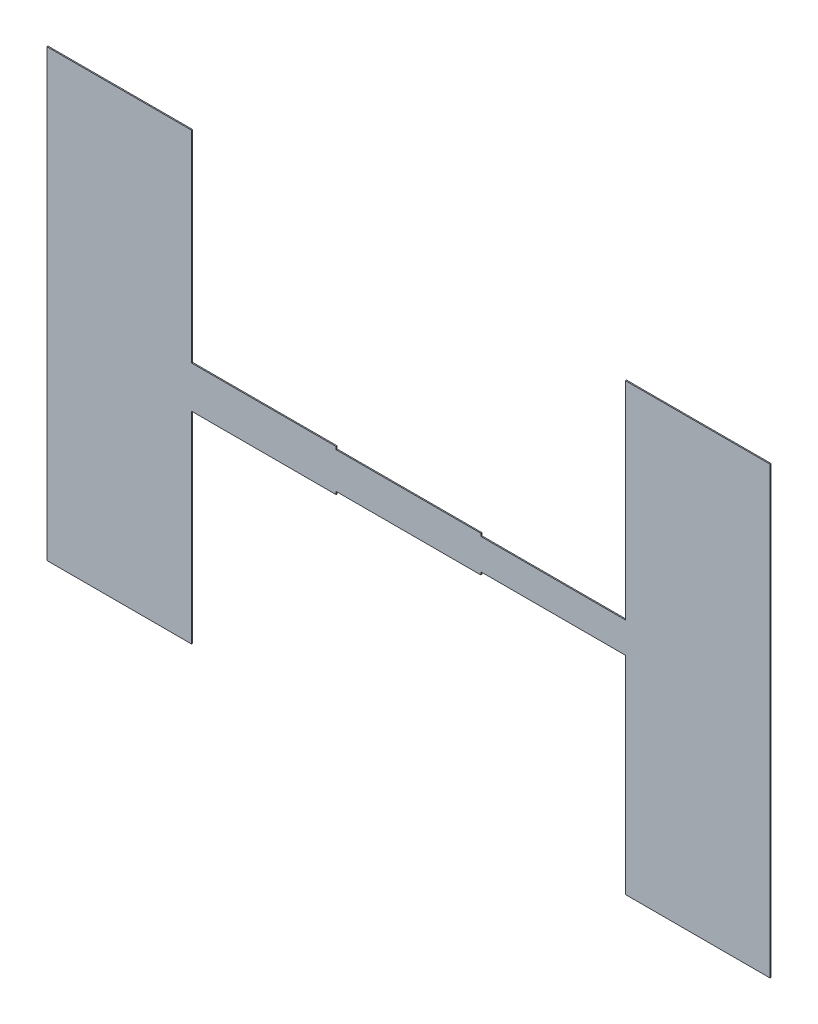
ISO-10303-21;
HEADER;
FILE_DESCRIPTION(('STEP AP214'),'2;1');
FILE_NAME('part.step','',(''),(''),'','','');
FILE_SCHEMA(('AUTOMOTIVE_DESIGN { 1 0 10303 214 1 1 1 1 }'));
ENDSEC;
DATA;
#1=APPLICATION_CONTEXT('core data for automotive mechanical design processes');
#2=APPLICATION_PROTOCOL_DEFINITION('international standard','automotive_design',2000,#1);
#3=PRODUCT_CONTEXT('',#1,'mechanical');
#4=PRODUCT('Part','Part','',(#3));
#5=PRODUCT_RELATED_PRODUCT_CATEGORY('part','',(#4));
#6=PRODUCT_DEFINITION_FORMATION('','',#4);
#7=PRODUCT_DEFINITION_CONTEXT('part definition',#1,'design');
#8=PRODUCT_DEFINITION('design','',#6,#7);
#9=PRODUCT_DEFINITION_SHAPE('','',#8);
#10=(LENGTH_UNIT() NAMED_UNIT(*) SI_UNIT(.MILLI.,.METRE.));
#11=(NAMED_UNIT(*) PLANE_ANGLE_UNIT() SI_UNIT($,.RADIAN.));
#12=(NAMED_UNIT(*) SI_UNIT($,.STERADIAN.) SOLID_ANGLE_UNIT());
#13=UNCERTAINTY_MEASURE_WITH_UNIT(LENGTH_MEASURE(1.E-05),#10,'distance_accuracy_value','');
#14=(GEOMETRIC_REPRESENTATION_CONTEXT(3) GLOBAL_UNCERTAINTY_ASSIGNED_CONTEXT((#13)) GLOBAL_UNIT_ASSIGNED_CONTEXT((#10,
#11,#12)) REPRESENTATION_CONTEXT('',''));
#15=CARTESIAN_POINT('',(0.,0.,0.));
#16=DIRECTION('',(0.,0.,1.));
#17=DIRECTION('',(1.,0.,0.));
#18=AXIS2_PLACEMENT_3D('',#15,#16,#17);
#19=CARTESIAN_POINT('',(4550.,0.,10.));
#20=DIRECTION('',(-1.,0.,0.));
#21=DIRECTION('',(0.,0.,1.));
#22=AXIS2_PLACEMENT_3D('',#19,#20,#21);
#23=PLANE('',#22);
#24=DIRECTION('',(0.,1.,0.));
#25=VECTOR('',#24,1.);
#26=CARTESIAN_POINT('',(4550.,0.,0.));
#27=LINE('',#26,#25);
#28=CARTESIAN_POINT('',(4550.,-2000.,0.));
#29=VERTEX_POINT('',#28);
#30=CARTESIAN_POINT('',(4550.,-137.5,0.));
#31=VERTEX_POINT('',#30);
#32=EDGE_CURVE('E220',#29,#31,#27,.T.);
#33=ORIENTED_EDGE('',*,*,#32,.F.);
#34=DIRECTION('',(0.,0.,-1.));
#35=VECTOR('',#34,1.);
#36=CARTESIAN_POINT('',(4550.,-2000.,10.));
#37=LINE('',#36,#35);
#38=CARTESIAN_POINT('',(4550.,-2000.,10.));
#39=VERTEX_POINT('',#38);
#40=EDGE_CURVE('E11',#39,#29,#37,.T.);
#41=ORIENTED_EDGE('',*,*,#40,.F.);
#42=DIRECTION('',(0.,1.,0.));
#43=VECTOR('',#42,1.);
#44=CARTESIAN_POINT('',(4550.,0.,10.));
#45=LINE('',#44,#43);
#46=CARTESIAN_POINT('',(4550.,-137.5,10.));
#47=VERTEX_POINT('',#46);
#48=EDGE_CURVE('E289',#39,#47,#45,.T.);
#49=ORIENTED_EDGE('',*,*,#48,.T.);
#50=DIRECTION('',(0.,0.,-1.));
#51=VECTOR('',#50,1.);
#52=CARTESIAN_POINT('',(4550.,-137.5,10.));
#53=LINE('',#52,#51);
#54=EDGE_CURVE('E64',#47,#31,#53,.T.);
#55=ORIENTED_EDGE('',*,*,#54,.T.);
#56=EDGE_LOOP('',(#33,#41,#49,#55));
#57=FACE_BOUND('',#56,.T.);
#58=ADVANCED_FACE('F47',(#57),#23,.T.);
#59=CARTESIAN_POINT('',(3.41607084500048E-13,-2000.,10.));
#60=DIRECTION('',(0.,-1.,0.));
#61=DIRECTION('',(1.,0.,0.));
#62=AXIS2_PLACEMENT_3D('',#59,#60,#61);
#63=PLANE('',#62);
#64=DIRECTION('',(-1.,0.,0.));
#65=VECTOR('',#64,1.);
#66=CARTESIAN_POINT('',(3.41607084500048E-13,-2000.,0.));
#67=LINE('',#66,#65);
#68=CARTESIAN_POINT('',(5850.,-2000.,0.));
#69=VERTEX_POINT('',#68);
#70=EDGE_CURVE('E223',#69,#29,#67,.T.);
#71=ORIENTED_EDGE('',*,*,#70,.F.);
#72=DIRECTION('',(0.,0.,-1.));
#73=VECTOR('',#72,1.);
#74=CARTESIAN_POINT('',(5850.,-2000.,10.));
#75=LINE('',#74,#73);
#76=CARTESIAN_POINT('',(5850.,-2000.,10.));
#77=VERTEX_POINT('',#76);
#78=EDGE_CURVE('E56',#77,#69,#75,.T.);
#79=ORIENTED_EDGE('',*,*,#78,.F.);
#80=DIRECTION('',(-1.,0.,0.));
#81=VECTOR('',#80,1.);
#82=CARTESIAN_POINT('',(3.41607084500048E-13,-2000.,10.));
#83=LINE('',#82,#81);
#84=EDGE_CURVE('E359',#77,#39,#83,.T.);
#85=ORIENTED_EDGE('',*,*,#84,.T.);
#86=ORIENTED_EDGE('',*,*,#40,.T.);
#87=EDGE_LOOP('',(#71,#79,#85,#86));
#88=FACE_BOUND('',#87,.T.);
#89=ADVANCED_FACE('F358',(#88),#63,.T.);
#90=CARTESIAN_POINT('',(5850.,0.,10.));
#91=DIRECTION('',(-1.,0.,0.));
#92=DIRECTION('',(0.,0.,1.));
#93=AXIS2_PLACEMENT_3D('',#90,#91,#92);
#94=PLANE('',#93);
#95=DIRECTION('',(0.,1.,0.));
#96=VECTOR('',#95,1.);
#97=CARTESIAN_POINT('',(5850.,0.,0.));
#98=LINE('',#97,#96);
#99=CARTESIAN_POINT('',(5850.,2000.,0.));
#100=VERTEX_POINT('',#99);
#101=EDGE_CURVE('E227',#69,#100,#98,.T.);
#102=ORIENTED_EDGE('',*,*,#101,.T.);
#103=DIRECTION('',(0.,0.,-1.));
#104=VECTOR('',#103,1.);
#105=CARTESIAN_POINT('',(5850.,2000.,10.));
#106=LINE('',#105,#104);
#107=CARTESIAN_POINT('',(5850.,2000.,10.));
#108=VERTEX_POINT('',#107);
#109=EDGE_CURVE('E341',#108,#100,#106,.T.);
#110=ORIENTED_EDGE('',*,*,#109,.F.);
#111=DIRECTION('',(0.,1.,0.));
#112=VECTOR('',#111,1.);
#113=CARTESIAN_POINT('',(5850.,0.,10.));
#114=LINE('',#113,#112);
#115=EDGE_CURVE('E350',#77,#108,#114,.T.);
#116=ORIENTED_EDGE('',*,*,#115,.F.);
#117=ORIENTED_EDGE('',*,*,#78,.T.);
#118=EDGE_LOOP('',(#102,#110,#116,#117));
#119=FACE_BOUND('',#118,.T.);
#120=ADVANCED_FACE('F348',(#119),#94,.F.);
#121=CARTESIAN_POINT('',(0.,2000.,10.));
#122=DIRECTION('',(0.,-1.,0.));
#123=DIRECTION('',(0.,0.,-1.));
#124=AXIS2_PLACEMENT_3D('',#121,#122,#123);
#125=PLANE('',#124);
#126=DIRECTION('',(-1.,0.,0.));
#127=VECTOR('',#126,1.);
#128=CARTESIAN_POINT('',(0.,2000.,0.));
#129=LINE('',#128,#127);
#130=CARTESIAN_POINT('',(4550.,2000.,0.));
#131=VERTEX_POINT('',#130);
#132=EDGE_CURVE('E230',#100,#131,#129,.T.);
#133=ORIENTED_EDGE('',*,*,#132,.T.);
#134=DIRECTION('',(0.,0.,-1.));
#135=VECTOR('',#134,1.);
#136=CARTESIAN_POINT('',(4550.,2000.,10.));
#137=LINE('',#136,#135);
#138=CARTESIAN_POINT('',(4550.,2000.,10.));
#139=VERTEX_POINT('',#138);
#140=EDGE_CURVE('E338',#139,#131,#137,.T.);
#141=ORIENTED_EDGE('',*,*,#140,.F.);
#142=DIRECTION('',(-1.,0.,0.));
#143=VECTOR('',#142,1.);
#144=CARTESIAN_POINT('',(0.,2000.,10.));
#145=LINE('',#144,#143);
#146=EDGE_CURVE('E609',#108,#139,#145,.T.);
#147=ORIENTED_EDGE('',*,*,#146,.F.);
#148=ORIENTED_EDGE('',*,*,#109,.T.);
#149=EDGE_LOOP('',(#133,#141,#147,#148));
#150=FACE_BOUND('',#149,.T.);
#151=ADVANCED_FACE('F377',(#150),#125,.F.);
#152=CARTESIAN_POINT('',(4550.,0.,10.));
#153=DIRECTION('',(-1.,0.,0.));
#154=DIRECTION('',(0.,0.,1.));
#155=AXIS2_PLACEMENT_3D('',#152,#153,#154);
#156=PLANE('',#155);
#157=DIRECTION('',(0.,1.,0.));
#158=VECTOR('',#157,1.);
#159=CARTESIAN_POINT('',(4550.,0.,0.));
#160=LINE('',#159,#158);
#161=CARTESIAN_POINT('',(4550.,137.5,0.));
#162=VERTEX_POINT('',#161);
#163=EDGE_CURVE('E234',#162,#131,#160,.T.);
#164=ORIENTED_EDGE('',*,*,#163,.F.);
#165=DIRECTION('',(0.,0.,-1.));
#166=VECTOR('',#165,1.);
#167=CARTESIAN_POINT('',(4550.,137.5,10.));
#168=LINE('',#167,#166);
#169=CARTESIAN_POINT('',(4550.,137.5,10.));
#170=VERTEX_POINT('',#169);
#171=EDGE_CURVE('E335',#170,#162,#168,.T.);
#172=ORIENTED_EDGE('',*,*,#171,.F.);
#173=DIRECTION('',(0.,1.,0.));
#174=VECTOR('',#173,1.);
#175=CARTESIAN_POINT('',(4550.,0.,10.));
#176=LINE('',#175,#174);
#177=EDGE_CURVE('E607',#170,#139,#176,.T.);
#178=ORIENTED_EDGE('',*,*,#177,.T.);
#179=ORIENTED_EDGE('',*,*,#140,.T.);
#180=EDGE_LOOP('',(#164,#172,#178,#179));
#181=FACE_BOUND('',#180,.T.);
#182=ADVANCED_FACE('F382',(#181),#156,.T.);
#183=CARTESIAN_POINT('',(0.,137.499999999999,10.));
#184=DIRECTION('',(0.,-1.,0.));
#185=DIRECTION('',(1.,0.,0.));
#186=AXIS2_PLACEMENT_3D('',#183,#184,#185);
#187=PLANE('',#186);
#188=DIRECTION('',(-1.,0.,0.));
#189=VECTOR('',#188,1.);
#190=CARTESIAN_POINT('',(0.,137.499999999999,0.));
#191=LINE('',#190,#189);
#192=CARTESIAN_POINT('',(3250.,137.5,0.));
#193=VERTEX_POINT('',#192);
#194=EDGE_CURVE('E238',#162,#193,#191,.T.);
#195=ORIENTED_EDGE('',*,*,#194,.T.);
#196=DIRECTION('',(0.,0.,-1.));
#197=VECTOR('',#196,1.);
#198=CARTESIAN_POINT('',(3250.,137.5,10.));
#199=LINE('',#198,#197);
#200=CARTESIAN_POINT('',(3250.,137.5,10.));
#201=VERTEX_POINT('',#200);
#202=EDGE_CURVE('E331',#201,#193,#199,.T.);
#203=ORIENTED_EDGE('',*,*,#202,.F.);
#204=DIRECTION('',(-1.,0.,0.));
#205=VECTOR('',#204,1.);
#206=CARTESIAN_POINT('',(0.,137.499999999999,10.));
#207=LINE('',#206,#205);
#208=EDGE_CURVE('E602',#170,#201,#207,.T.);
#209=ORIENTED_EDGE('',*,*,#208,.F.);
#210=ORIENTED_EDGE('',*,*,#171,.T.);
#211=EDGE_LOOP('',(#195,#203,#209,#210));
#212=FACE_BOUND('',#211,.T.);
#213=ADVANCED_FACE('F386',(#212),#187,.F.);
#214=CARTESIAN_POINT('',(3250.,0.,10.));
#215=DIRECTION('',(-1.,0.,0.));
#216=DIRECTION('',(0.,0.,1.));
#217=AXIS2_PLACEMENT_3D('',#214,#215,#216);
#218=PLANE('',#217);
#219=DIRECTION('',(0.,1.,0.));
#220=VECTOR('',#219,1.);
#221=CARTESIAN_POINT('',(3250.,0.,0.));
#222=LINE('',#221,#220);
#223=CARTESIAN_POINT('',(3250.,162.5,0.));
#224=VERTEX_POINT('',#223);
#225=EDGE_CURVE('E241',#193,#224,#222,.T.);
#226=ORIENTED_EDGE('',*,*,#225,.T.);
#227=DIRECTION('',(0.,0.,-1.));
#228=VECTOR('',#227,1.);
#229=CARTESIAN_POINT('',(3250.,162.5,10.));
#230=LINE('',#229,#228);
#231=CARTESIAN_POINT('',(3250.,162.5,10.));
#232=VERTEX_POINT('',#231);
#233=EDGE_CURVE('E327',#232,#224,#230,.T.);
#234=ORIENTED_EDGE('',*,*,#233,.F.);
#235=DIRECTION('',(0.,1.,0.));
#236=VECTOR('',#235,1.);
#237=CARTESIAN_POINT('',(3250.,0.,10.));
#238=LINE('',#237,#236);
#239=EDGE_CURVE('E599',#201,#232,#238,.T.);
#240=ORIENTED_EDGE('',*,*,#239,.F.);
#241=ORIENTED_EDGE('',*,*,#202,.T.);
#242=EDGE_LOOP('',(#226,#234,#240,#241));
#243=FACE_BOUND('',#242,.T.);
#244=ADVANCED_FACE('F390',(#243),#218,.F.);
#245=CARTESIAN_POINT('',(0.,162.5,10.));
#246=DIRECTION('',(0.,-1.,0.));
#247=DIRECTION('',(1.,0.,0.));
#248=AXIS2_PLACEMENT_3D('',#245,#246,#247);
#249=PLANE('',#248);
#250=DIRECTION('',(-1.,0.,0.));
#251=VECTOR('',#250,1.);
#252=CARTESIAN_POINT('',(0.,162.5,0.));
#253=LINE('',#252,#251);
#254=CARTESIAN_POINT('',(1950.,162.5,0.));
#255=VERTEX_POINT('',#254);
#256=EDGE_CURVE('E244',#224,#255,#253,.T.);
#257=ORIENTED_EDGE('',*,*,#256,.T.);
#258=DIRECTION('',(0.,0.,-1.));
#259=VECTOR('',#258,1.);
#260=CARTESIAN_POINT('',(1950.,162.5,10.));
#261=LINE('',#260,#259);
#262=CARTESIAN_POINT('',(1950.,162.5,10.));
#263=VERTEX_POINT('',#262);
#264=EDGE_CURVE('E323',#263,#255,#261,.T.);
#265=ORIENTED_EDGE('',*,*,#264,.F.);
#266=DIRECTION('',(-1.,0.,0.));
#267=VECTOR('',#266,1.);
#268=CARTESIAN_POINT('',(0.,162.5,10.));
#269=LINE('',#268,#267);
#270=EDGE_CURVE('E597',#232,#263,#269,.T.);
#271=ORIENTED_EDGE('',*,*,#270,.F.);
#272=ORIENTED_EDGE('',*,*,#233,.T.);
#273=EDGE_LOOP('',(#257,#265,#271,#272));
#274=FACE_BOUND('',#273,.T.);
#275=ADVANCED_FACE('F394',(#274),#249,.F.);
#276=CARTESIAN_POINT('',(1950.,0.,10.));
#277=DIRECTION('',(-1.,0.,0.));
#278=DIRECTION('',(0.,0.,1.));
#279=AXIS2_PLACEMENT_3D('',#276,#277,#278);
#280=PLANE('',#279);
#281=DIRECTION('',(0.,1.,0.));
#282=VECTOR('',#281,1.);
#283=CARTESIAN_POINT('',(1950.,0.,0.));
#284=LINE('',#283,#282);
#285=CARTESIAN_POINT('',(1950.,187.5,0.));
#286=VERTEX_POINT('',#285);
#287=EDGE_CURVE('E247',#255,#286,#284,.T.);
#288=ORIENTED_EDGE('',*,*,#287,.T.);
#289=DIRECTION('',(0.,0.,-1.));
#290=VECTOR('',#289,1.);
#291=CARTESIAN_POINT('',(1950.,187.5,10.));
#292=LINE('',#291,#290);
#293=CARTESIAN_POINT('',(1950.,187.5,10.));
#294=VERTEX_POINT('',#293);
#295=EDGE_CURVE('E319',#294,#286,#292,.T.);
#296=ORIENTED_EDGE('',*,*,#295,.F.);
#297=DIRECTION('',(0.,1.,0.));
#298=VECTOR('',#297,1.);
#299=CARTESIAN_POINT('',(1950.,0.,10.));
#300=LINE('',#299,#298);
#301=EDGE_CURVE('E590',#263,#294,#300,.T.);
#302=ORIENTED_EDGE('',*,*,#301,.F.);
#303=ORIENTED_EDGE('',*,*,#264,.T.);
#304=EDGE_LOOP('',(#288,#296,#302,#303));
#305=FACE_BOUND('',#304,.T.);
#306=ADVANCED_FACE('F398',(#305),#280,.F.);
#307=CARTESIAN_POINT('',(0.,187.499999999999,10.));
#308=DIRECTION('',(0.,-1.,0.));
#309=DIRECTION('',(1.,0.,0.));
#310=AXIS2_PLACEMENT_3D('',#307,#308,#309);
#311=PLANE('',#310);
#312=DIRECTION('',(-1.,0.,0.));
#313=VECTOR('',#312,1.);
#314=CARTESIAN_POINT('',(0.,187.499999999999,0.));
#315=LINE('',#314,#313);
#316=CARTESIAN_POINT('',(650.,187.5,0.));
#317=VERTEX_POINT('',#316);
#318=EDGE_CURVE('E250',#286,#317,#315,.T.);
#319=ORIENTED_EDGE('',*,*,#318,.T.);
#320=DIRECTION('',(0.,0.,-1.));
#321=VECTOR('',#320,1.);
#322=CARTESIAN_POINT('',(650.,187.5,10.));
#323=LINE('',#322,#321);
#324=CARTESIAN_POINT('',(650.,187.5,10.));
#325=VERTEX_POINT('',#324);
#326=EDGE_CURVE('E315',#325,#317,#323,.T.);
#327=ORIENTED_EDGE('',*,*,#326,.F.);
#328=DIRECTION('',(-1.,0.,0.));
#329=VECTOR('',#328,1.);
#330=CARTESIAN_POINT('',(0.,187.499999999999,10.));
#331=LINE('',#330,#329);
#332=EDGE_CURVE('E587',#294,#325,#331,.T.);
#333=ORIENTED_EDGE('',*,*,#332,.F.);
#334=ORIENTED_EDGE('',*,*,#295,.T.);
#335=EDGE_LOOP('',(#319,#327,#333,#334));
#336=FACE_BOUND('',#335,.T.);
#337=ADVANCED_FACE('F402',(#336),#311,.F.);
#338=CARTESIAN_POINT('',(650.,0.,10.));
#339=DIRECTION('',(-1.,0.,0.));
#340=DIRECTION('',(0.,0.,1.));
#341=AXIS2_PLACEMENT_3D('',#338,#339,#340);
#342=PLANE('',#341);
#343=DIRECTION('',(0.,1.,0.));
#344=VECTOR('',#343,1.);
#345=CARTESIAN_POINT('',(650.,0.,0.));
#346=LINE('',#345,#344);
#347=CARTESIAN_POINT('',(650.,2000.,0.));
#348=VERTEX_POINT('',#347);
#349=EDGE_CURVE('E253',#317,#348,#346,.T.);
#350=ORIENTED_EDGE('',*,*,#349,.T.);
#351=DIRECTION('',(0.,0.,-1.));
#352=VECTOR('',#351,1.);
#353=CARTESIAN_POINT('',(650.,2000.,10.));
#354=LINE('',#353,#352);
#355=CARTESIAN_POINT('',(650.,2000.,10.));
#356=VERTEX_POINT('',#355);
#357=EDGE_CURVE('E312',#356,#348,#354,.T.);
#358=ORIENTED_EDGE('',*,*,#357,.F.);
#359=DIRECTION('',(0.,1.,0.));
#360=VECTOR('',#359,1.);
#361=CARTESIAN_POINT('',(650.,0.,10.));
#362=LINE('',#361,#360);
#363=EDGE_CURVE('E585',#325,#356,#362,.T.);
#364=ORIENTED_EDGE('',*,*,#363,.F.);
#365=ORIENTED_EDGE('',*,*,#326,.T.);
#366=EDGE_LOOP('',(#350,#358,#364,#365));
#367=FACE_BOUND('',#366,.T.);
#368=ADVANCED_FACE('F406',(#367),#342,.F.);
#369=CARTESIAN_POINT('',(0.,2000.,10.));
#370=DIRECTION('',(0.,1.,0.));
#371=DIRECTION('',(0.,0.,1.));
#372=AXIS2_PLACEMENT_3D('',#369,#370,#371);
#373=PLANE('',#372);
#374=DIRECTION('',(1.,0.,0.));
#375=VECTOR('',#374,1.);
#376=CARTESIAN_POINT('',(0.,2000.,0.));
#377=LINE('',#376,#375);
#378=CARTESIAN_POINT('',(-650.,2000.,0.));
#379=VERTEX_POINT('',#378);
#380=EDGE_CURVE('E257',#379,#348,#377,.T.);
#381=ORIENTED_EDGE('',*,*,#380,.F.);
#382=DIRECTION('',(0.,0.,-1.));
#383=VECTOR('',#382,1.);
#384=CARTESIAN_POINT('',(-650.,2000.,10.));
#385=LINE('',#384,#383);
#386=CARTESIAN_POINT('',(-650.,2000.,10.));
#387=VERTEX_POINT('',#386);
#388=EDGE_CURVE('E309',#387,#379,#385,.T.);
#389=ORIENTED_EDGE('',*,*,#388,.F.);
#390=DIRECTION('',(1.,0.,0.));
#391=VECTOR('',#390,1.);
#392=CARTESIAN_POINT('',(0.,2000.,10.));
#393=LINE('',#392,#391);
#394=EDGE_CURVE('E630',#387,#356,#393,.T.);
#395=ORIENTED_EDGE('',*,*,#394,.T.);
#396=ORIENTED_EDGE('',*,*,#357,.T.);
#397=EDGE_LOOP('',(#381,#389,#395,#396));
#398=FACE_BOUND('',#397,.T.);
#399=ADVANCED_FACE('F410',(#398),#373,.T.);
#400=CARTESIAN_POINT('',(-650.,0.,10.));
#401=DIRECTION('',(-1.,0.,0.));
#402=DIRECTION('',(0.,0.,1.));
#403=AXIS2_PLACEMENT_3D('',#400,#401,#402);
#404=PLANE('',#403);
#405=DIRECTION('',(0.,1.,0.));
#406=VECTOR('',#405,1.);
#407=CARTESIAN_POINT('',(-650.,0.,0.));
#408=LINE('',#407,#406);
#409=CARTESIAN_POINT('',(-650.,-2000.,0.));
#410=VERTEX_POINT('',#409);
#411=EDGE_CURVE('E261',#410,#379,#408,.T.);
#412=ORIENTED_EDGE('',*,*,#411,.F.);
#413=DIRECTION('',(0.,0.,-1.));
#414=VECTOR('',#413,1.);
#415=CARTESIAN_POINT('',(-650.,-2000.,10.));
#416=LINE('',#415,#414);
#417=CARTESIAN_POINT('',(-650.,-2000.,10.));
#418=VERTEX_POINT('',#417);
#419=EDGE_CURVE('E306',#418,#410,#416,.T.);
#420=ORIENTED_EDGE('',*,*,#419,.F.);
#421=DIRECTION('',(0.,1.,0.));
#422=VECTOR('',#421,1.);
#423=CARTESIAN_POINT('',(-650.,0.,10.));
#424=LINE('',#423,#422);
#425=EDGE_CURVE('E576',#418,#387,#424,.T.);
#426=ORIENTED_EDGE('',*,*,#425,.T.);
#427=ORIENTED_EDGE('',*,*,#388,.T.);
#428=EDGE_LOOP('',(#412,#420,#426,#427));
#429=FACE_BOUND('',#428,.T.);
#430=ADVANCED_FACE('F414',(#429),#404,.T.);
#431=CARTESIAN_POINT('',(0.,-2000.,10.));
#432=DIRECTION('',(0.,1.,0.));
#433=DIRECTION('',(0.,0.,1.));
#434=AXIS2_PLACEMENT_3D('',#431,#432,#433);
#435=PLANE('',#434);
#436=DIRECTION('',(1.,0.,0.));
#437=VECTOR('',#436,1.);
#438=CARTESIAN_POINT('',(0.,-2000.,0.));
#439=LINE('',#438,#437);
#440=CARTESIAN_POINT('',(650.,-2000.,0.));
#441=VERTEX_POINT('',#440);
#442=EDGE_CURVE('E265',#410,#441,#439,.T.);
#443=ORIENTED_EDGE('',*,*,#442,.T.);
#444=DIRECTION('',(0.,0.,-1.));
#445=VECTOR('',#444,1.);
#446=CARTESIAN_POINT('',(650.,-2000.,10.));
#447=LINE('',#446,#445);
#448=CARTESIAN_POINT('',(650.,-2000.,10.));
#449=VERTEX_POINT('',#448);
#450=EDGE_CURVE('E302',#449,#441,#447,.T.);
#451=ORIENTED_EDGE('',*,*,#450,.F.);
#452=DIRECTION('',(1.,0.,0.));
#453=VECTOR('',#452,1.);
#454=CARTESIAN_POINT('',(0.,-2000.,10.));
#455=LINE('',#454,#453);
#456=EDGE_CURVE('E635',#418,#449,#455,.T.);
#457=ORIENTED_EDGE('',*,*,#456,.F.);
#458=ORIENTED_EDGE('',*,*,#419,.T.);
#459=EDGE_LOOP('',(#443,#451,#457,#458));
#460=FACE_BOUND('',#459,.T.);
#461=ADVANCED_FACE('F418',(#460),#435,.F.);
#462=CARTESIAN_POINT('',(650.,0.,10.));
#463=DIRECTION('',(-1.,0.,0.));
#464=DIRECTION('',(0.,-1.,0.));
#465=AXIS2_PLACEMENT_3D('',#462,#463,#464);
#466=PLANE('',#465);
#467=DIRECTION('',(0.,1.,0.));
#468=VECTOR('',#467,1.);
#469=CARTESIAN_POINT('',(650.,0.,0.));
#470=LINE('',#469,#468);
#471=CARTESIAN_POINT('',(650.,-187.5,0.));
#472=VERTEX_POINT('',#471);
#473=EDGE_CURVE('E268',#441,#472,#470,.T.);
#474=ORIENTED_EDGE('',*,*,#473,.T.);
#475=DIRECTION('',(0.,0.,-1.));
#476=VECTOR('',#475,1.);
#477=CARTESIAN_POINT('',(650.,-187.5,10.));
#478=LINE('',#477,#476);
#479=CARTESIAN_POINT('',(650.,-187.5,10.));
#480=VERTEX_POINT('',#479);
#481=EDGE_CURVE('E299',#480,#472,#478,.T.);
#482=ORIENTED_EDGE('',*,*,#481,.F.);
#483=DIRECTION('',(0.,1.,0.));
#484=VECTOR('',#483,1.);
#485=CARTESIAN_POINT('',(650.,0.,10.));
#486=LINE('',#485,#484);
#487=EDGE_CURVE('E638',#449,#480,#486,.T.);
#488=ORIENTED_EDGE('',*,*,#487,.F.);
#489=ORIENTED_EDGE('',*,*,#450,.T.);
#490=EDGE_LOOP('',(#474,#482,#488,#489));
#491=FACE_BOUND('',#490,.T.);
#492=ADVANCED_FACE('F422',(#491),#466,.F.);
#493=CARTESIAN_POINT('',(0.,-187.500000000001,10.));
#494=DIRECTION('',(0.,-1.,0.));
#495=DIRECTION('',(1.,0.,0.));
#496=AXIS2_PLACEMENT_3D('',#493,#494,#495);
#497=PLANE('',#496);
#498=DIRECTION('',(-1.,0.,0.));
#499=VECTOR('',#498,1.);
#500=CARTESIAN_POINT('',(0.,-187.500000000001,0.));
#501=LINE('',#500,#499);
#502=CARTESIAN_POINT('',(1950.,-187.5,0.));
#503=VERTEX_POINT('',#502);
#504=EDGE_CURVE('E272',#503,#472,#501,.T.);
#505=ORIENTED_EDGE('',*,*,#504,.F.);
#506=DIRECTION('',(0.,0.,-1.));
#507=VECTOR('',#506,1.);
#508=CARTESIAN_POINT('',(1950.,-187.5,10.));
#509=LINE('',#508,#507);
#510=CARTESIAN_POINT('',(1950.,-187.5,10.));
#511=VERTEX_POINT('',#510);
#512=EDGE_CURVE('E296',#511,#503,#509,.T.);
#513=ORIENTED_EDGE('',*,*,#512,.F.);
#514=DIRECTION('',(-1.,0.,0.));
#515=VECTOR('',#514,1.);
#516=CARTESIAN_POINT('',(0.,-187.500000000001,10.));
#517=LINE('',#516,#515);
#518=EDGE_CURVE('E214',#511,#480,#517,.T.);
#519=ORIENTED_EDGE('',*,*,#518,.T.);
#520=ORIENTED_EDGE('',*,*,#481,.T.);
#521=EDGE_LOOP('',(#505,#513,#519,#520));
#522=FACE_BOUND('',#521,.T.);
#523=ADVANCED_FACE('F426',(#522),#497,.T.);
#524=CARTESIAN_POINT('',(1950.,0.,10.));
#525=DIRECTION('',(-1.,0.,0.));
#526=DIRECTION('',(0.,0.,1.));
#527=AXIS2_PLACEMENT_3D('',#524,#525,#526);
#528=PLANE('',#527);
#529=DIRECTION('',(0.,1.,0.));
#530=VECTOR('',#529,1.);
#531=CARTESIAN_POINT('',(1950.,0.,0.));
#532=LINE('',#531,#530);
#533=CARTESIAN_POINT('',(1950.,-162.5,0.));
#534=VERTEX_POINT('',#533);
#535=EDGE_CURVE('E276',#503,#534,#532,.T.);
#536=ORIENTED_EDGE('',*,*,#535,.T.);
#537=DIRECTION('',(0.,0.,-1.));
#538=VECTOR('',#537,1.);
#539=CARTESIAN_POINT('',(1950.,-162.5,10.));
#540=LINE('',#539,#538);
#541=CARTESIAN_POINT('',(1950.,-162.5,10.));
#542=VERTEX_POINT('',#541);
#543=EDGE_CURVE('E197',#542,#534,#540,.T.);
#544=ORIENTED_EDGE('',*,*,#543,.F.);
#545=DIRECTION('',(0.,1.,0.));
#546=VECTOR('',#545,1.);
#547=CARTESIAN_POINT('',(1950.,0.,10.));
#548=LINE('',#547,#546);
#549=EDGE_CURVE('E209',#511,#542,#548,.T.);
#550=ORIENTED_EDGE('',*,*,#549,.F.);
#551=ORIENTED_EDGE('',*,*,#512,.T.);
#552=EDGE_LOOP('',(#536,#544,#550,#551));
#553=FACE_BOUND('',#552,.T.);
#554=ADVANCED_FACE('F430',(#553),#528,.F.);
#555=CARTESIAN_POINT('',(0.,-162.5,10.));
#556=DIRECTION('',(0.,-1.,0.));
#557=DIRECTION('',(1.,0.,0.));
#558=AXIS2_PLACEMENT_3D('',#555,#556,#557);
#559=PLANE('',#558);
#560=DIRECTION('',(-1.,0.,0.));
#561=VECTOR('',#560,1.);
#562=CARTESIAN_POINT('',(0.,-162.5,0.));
#563=LINE('',#562,#561);
#564=CARTESIAN_POINT('',(3250.,-162.5,0.));
#565=VERTEX_POINT('',#564);
#566=EDGE_CURVE('E193',#565,#534,#563,.T.);
#567=ORIENTED_EDGE('',*,*,#566,.F.);
#568=DIRECTION('',(0.,0.,-1.));
#569=VECTOR('',#568,1.);
#570=CARTESIAN_POINT('',(3250.,-162.5,10.));
#571=LINE('',#570,#569);
#572=CARTESIAN_POINT('',(3250.,-162.5,10.));
#573=VERTEX_POINT('',#572);
#574=EDGE_CURVE('E187',#573,#565,#571,.T.);
#575=ORIENTED_EDGE('',*,*,#574,.F.);
#576=DIRECTION('',(-1.,0.,0.));
#577=VECTOR('',#576,1.);
#578=CARTESIAN_POINT('',(0.,-162.5,10.));
#579=LINE('',#578,#577);
#580=EDGE_CURVE('E191',#573,#542,#579,.T.);
#581=ORIENTED_EDGE('',*,*,#580,.T.);
#582=ORIENTED_EDGE('',*,*,#543,.T.);
#583=EDGE_LOOP('',(#567,#575,#581,#582));
#584=FACE_BOUND('',#583,.T.);
#585=ADVANCED_FACE('F189',(#584),#559,.T.);
#586=CARTESIAN_POINT('',(3250.,0.,10.));
#587=DIRECTION('',(-1.,0.,0.));
#588=DIRECTION('',(0.,0.,1.));
#589=AXIS2_PLACEMENT_3D('',#586,#587,#588);
#590=PLANE('',#589);
#591=DIRECTION('',(0.,1.,0.));
#592=VECTOR('',#591,1.);
#593=CARTESIAN_POINT('',(3250.,0.,0.));
#594=LINE('',#593,#592);
#595=CARTESIAN_POINT('',(3250.,-137.5,0.));
#596=VERTEX_POINT('',#595);
#597=EDGE_CURVE('E282',#565,#596,#594,.T.);
#598=ORIENTED_EDGE('',*,*,#597,.T.);
#599=DIRECTION('',(0.,0.,-1.));
#600=VECTOR('',#599,1.);
#601=CARTESIAN_POINT('',(3250.,-137.5,10.));
#602=LINE('',#601,#600);
#603=CARTESIAN_POINT('',(3250.,-137.5,10.));
#604=VERTEX_POINT('',#603);
#605=EDGE_CURVE('E126',#604,#596,#602,.T.);
#606=ORIENTED_EDGE('',*,*,#605,.F.);
#607=DIRECTION('',(0.,1.,0.));
#608=VECTOR('',#607,1.);
#609=CARTESIAN_POINT('',(3250.,0.,10.));
#610=LINE('',#609,#608);
#611=EDGE_CURVE('E199',#573,#604,#610,.T.);
#612=ORIENTED_EDGE('',*,*,#611,.F.);
#613=ORIENTED_EDGE('',*,*,#574,.T.);
#614=EDGE_LOOP('',(#598,#606,#612,#613));
#615=FACE_BOUND('',#614,.T.);
#616=ADVANCED_FACE('F200',(#615),#590,.F.);
#617=CARTESIAN_POINT('',(0.,-137.500000000001,10.));
#618=DIRECTION('',(0.,-1.,0.));
#619=DIRECTION('',(1.,0.,0.));
#620=AXIS2_PLACEMENT_3D('',#617,#618,#619);
#621=PLANE('',#620);
#622=DIRECTION('',(-1.,0.,0.));
#623=VECTOR('',#622,1.);
#624=CARTESIAN_POINT('',(0.,-137.500000000001,0.));
#625=LINE('',#624,#623);
#626=EDGE_CURVE('E285',#31,#596,#625,.T.);
#627=ORIENTED_EDGE('',*,*,#626,.F.);
#628=ORIENTED_EDGE('',*,*,#54,.F.);
#629=DIRECTION('',(-1.,0.,0.));
#630=VECTOR('',#629,1.);
#631=CARTESIAN_POINT('',(0.,-137.500000000001,10.));
#632=LINE('',#631,#630);
#633=EDGE_CURVE('E204',#47,#604,#632,.T.);
#634=ORIENTED_EDGE('',*,*,#633,.T.);
#635=ORIENTED_EDGE('',*,*,#605,.T.);
#636=EDGE_LOOP('',(#627,#628,#634,#635));
#637=FACE_BOUND('',#636,.T.);
#638=ADVANCED_FACE('F360',(#637),#621,.T.);
#639=CARTESIAN_POINT('',(0.,0.,10.));
#640=DIRECTION('',(0.,0.,1.));
#641=DIRECTION('',(1.,0.,0.));
#642=AXIS2_PLACEMENT_3D('',#639,#640,#641);
#643=PLANE('',#642);
#644=ORIENTED_EDGE('',*,*,#48,.F.);
#645=ORIENTED_EDGE('',*,*,#84,.F.);
#646=ORIENTED_EDGE('',*,*,#115,.T.);
#647=ORIENTED_EDGE('',*,*,#146,.T.);
#648=ORIENTED_EDGE('',*,*,#177,.F.);
#649=ORIENTED_EDGE('',*,*,#208,.T.);
#650=ORIENTED_EDGE('',*,*,#239,.T.);
#651=ORIENTED_EDGE('',*,*,#270,.T.);
#652=ORIENTED_EDGE('',*,*,#301,.T.);
#653=ORIENTED_EDGE('',*,*,#332,.T.);
#654=ORIENTED_EDGE('',*,*,#363,.T.);
#655=ORIENTED_EDGE('',*,*,#394,.F.);
#656=ORIENTED_EDGE('',*,*,#425,.F.);
#657=ORIENTED_EDGE('',*,*,#456,.T.);
#658=ORIENTED_EDGE('',*,*,#487,.T.);
#659=ORIENTED_EDGE('',*,*,#518,.F.);
#660=ORIENTED_EDGE('',*,*,#549,.T.);
#661=ORIENTED_EDGE('',*,*,#580,.F.);
#662=ORIENTED_EDGE('',*,*,#611,.T.);
#663=ORIENTED_EDGE('',*,*,#633,.F.);
#664=EDGE_LOOP('',(#644,#645,#646,#647,#648,#649,#650,#651,#652,#653,#654,#655,#656,#657,#658,
#659,#660,#661,#662,#663));
#665=FACE_BOUND('',#664,.T.);
#666=ADVANCED_FACE('F206',(#665),#643,.T.);
#667=CARTESIAN_POINT('',(0.,0.,0.));
#668=DIRECTION('',(0.,0.,1.));
#669=DIRECTION('',(1.,0.,0.));
#670=AXIS2_PLACEMENT_3D('',#667,#668,#669);
#671=PLANE('',#670);
#672=ORIENTED_EDGE('',*,*,#32,.T.);
#673=ORIENTED_EDGE('',*,*,#626,.T.);
#674=ORIENTED_EDGE('',*,*,#597,.F.);
#675=ORIENTED_EDGE('',*,*,#566,.T.);
#676=ORIENTED_EDGE('',*,*,#535,.F.);
#677=ORIENTED_EDGE('',*,*,#504,.T.);
#678=ORIENTED_EDGE('',*,*,#473,.F.);
#679=ORIENTED_EDGE('',*,*,#442,.F.);
#680=ORIENTED_EDGE('',*,*,#411,.T.);
#681=ORIENTED_EDGE('',*,*,#380,.T.);
#682=ORIENTED_EDGE('',*,*,#349,.F.);
#683=ORIENTED_EDGE('',*,*,#318,.F.);
#684=ORIENTED_EDGE('',*,*,#287,.F.);
#685=ORIENTED_EDGE('',*,*,#256,.F.);
#686=ORIENTED_EDGE('',*,*,#225,.F.);
#687=ORIENTED_EDGE('',*,*,#194,.F.);
#688=ORIENTED_EDGE('',*,*,#163,.T.);
#689=ORIENTED_EDGE('',*,*,#132,.F.);
#690=ORIENTED_EDGE('',*,*,#101,.F.);
#691=ORIENTED_EDGE('',*,*,#70,.T.);
#692=EDGE_LOOP('',(#672,#673,#674,#675,#676,#677,#678,#679,#680,#681,#682,#683,#684,#685,#686,
#687,#688,#689,#690,#691));
#693=FACE_BOUND('',#692,.T.);
#694=ADVANCED_FACE('F357',(#693),#671,.F.);
#695=CLOSED_SHELL('',(#58,#89,#120,#151,#182,#213,#244,#275,#306,#337,#368,#399,#430,#461,#492,
#523,#554,#585,#616,#638,#666,#694));
#696=MANIFOLD_SOLID_BREP('B2',#695);
#697=ADVANCED_BREP_SHAPE_REPRESENTATION('',(#18,#696),#14);
#698=SHAPE_DEFINITION_REPRESENTATION(#9,#697);
ENDSEC;
END-ISO-10303-21;
